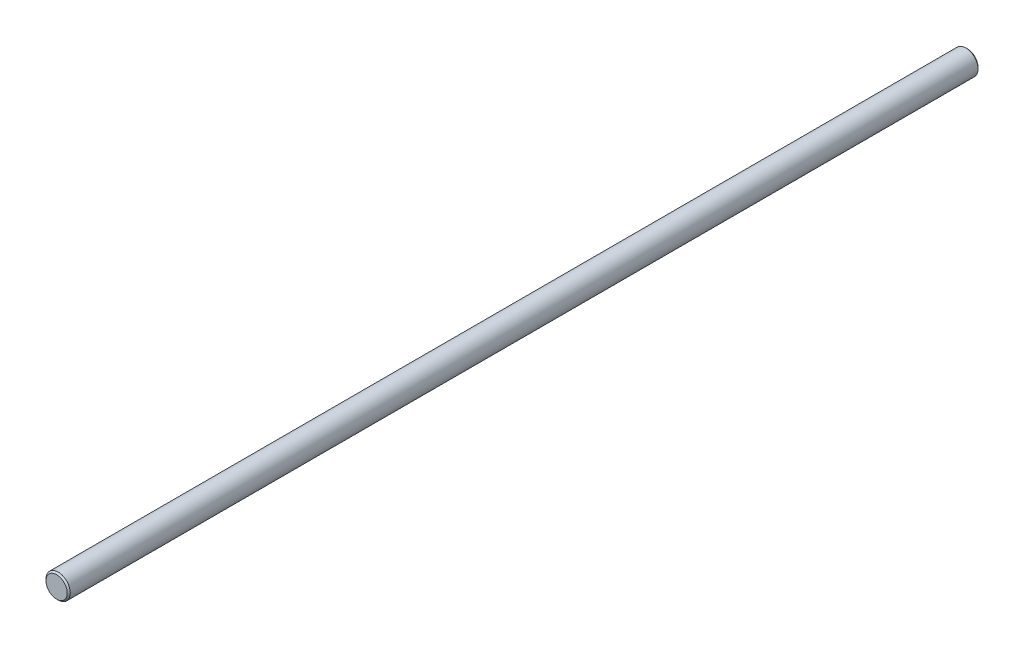
ISO-10303-21;
HEADER;
FILE_DESCRIPTION(('STEP AP214'),'2;1');
FILE_NAME('part.step','',(''),(''),'','','');
FILE_SCHEMA(('AUTOMOTIVE_DESIGN { 1 0 10303 214 1 1 1 1 }'));
ENDSEC;
DATA;
#1=APPLICATION_CONTEXT('core data for automotive mechanical design processes');
#2=APPLICATION_PROTOCOL_DEFINITION('international standard','automotive_design',2000,#1);
#3=PRODUCT_CONTEXT('',#1,'mechanical');
#4=PRODUCT('Part','Part','',(#3));
#5=PRODUCT_RELATED_PRODUCT_CATEGORY('part','',(#4));
#6=PRODUCT_DEFINITION_FORMATION('','',#4);
#7=PRODUCT_DEFINITION_CONTEXT('part definition',#1,'design');
#8=PRODUCT_DEFINITION('design','',#6,#7);
#9=PRODUCT_DEFINITION_SHAPE('','',#8);
#10=(LENGTH_UNIT() NAMED_UNIT(*) SI_UNIT(.MILLI.,.METRE.));
#11=(NAMED_UNIT(*) PLANE_ANGLE_UNIT() SI_UNIT($,.RADIAN.));
#12=(NAMED_UNIT(*) SI_UNIT($,.STERADIAN.) SOLID_ANGLE_UNIT());
#13=UNCERTAINTY_MEASURE_WITH_UNIT(LENGTH_MEASURE(1.E-05),#10,'distance_accuracy_value','');
#14=(GEOMETRIC_REPRESENTATION_CONTEXT(3) GLOBAL_UNCERTAINTY_ASSIGNED_CONTEXT((#13)) GLOBAL_UNIT_ASSIGNED_CONTEXT((#10,
#11,#12)) REPRESENTATION_CONTEXT('',''));
#15=CARTESIAN_POINT('',(0.,0.,0.));
#16=DIRECTION('',(0.,0.,1.));
#17=DIRECTION('',(1.,0.,0.));
#18=AXIS2_PLACEMENT_3D('',#15,#16,#17);
#19=CARTESIAN_POINT('',(0.,0.,300.));
#20=DIRECTION('',(0.,0.,-1.));
#21=DIRECTION('',(-1.,0.,0.));
#22=AXIS2_PLACEMENT_3D('',#19,#20,#21);
#23=CYLINDRICAL_SURFACE('',#22,4.);
#24=CARTESIAN_POINT('',(0.,0.,299.5));
#25=DIRECTION('',(0.,0.,1.));
#26=DIRECTION('',(1.,0.,0.));
#27=AXIS2_PLACEMENT_3D('',#24,#25,#26);
#28=CIRCLE('',#27,4.);
#29=CARTESIAN_POINT('',(4.,0.,299.5));
#30=VERTEX_POINT('',#29);
#31=EDGE_CURVE('E36',#30,#30,#28,.F.);
#32=ORIENTED_EDGE('',*,*,#31,.T.);
#33=EDGE_LOOP('',(#32));
#34=FACE_BOUND('',#33,.T.);
#35=CARTESIAN_POINT('',(0.,0.,0.500000000000056));
#36=DIRECTION('',(0.,0.,1.));
#37=DIRECTION('',(1.,0.,0.));
#38=AXIS2_PLACEMENT_3D('',#35,#36,#37);
#39=CIRCLE('',#38,4.);
#40=CARTESIAN_POINT('',(4.,0.,0.500000000000056));
#41=VERTEX_POINT('',#40);
#42=EDGE_CURVE('E40',#41,#41,#39,.T.);
#43=ORIENTED_EDGE('',*,*,#42,.T.);
#44=EDGE_LOOP('',(#43));
#45=FACE_BOUND('',#44,.T.);
#46=ADVANCED_FACE('F29',(#34,#45),#23,.T.);
#47=CARTESIAN_POINT('',(0.,0.,300.));
#48=DIRECTION('',(0.,0.,1.));
#49=DIRECTION('',(1.,0.,0.));
#50=AXIS2_PLACEMENT_3D('',#47,#48,#49);
#51=PLANE('',#50);
#52=CARTESIAN_POINT('',(0.,0.,300.));
#53=DIRECTION('',(0.,0.,1.));
#54=DIRECTION('',(1.,0.,0.));
#55=AXIS2_PLACEMENT_3D('',#52,#53,#54);
#56=CIRCLE('',#55,3.5);
#57=CARTESIAN_POINT('',(3.5,0.,300.));
#58=VERTEX_POINT('',#57);
#59=EDGE_CURVE('E44',#58,#58,#56,.T.);
#60=ORIENTED_EDGE('',*,*,#59,.T.);
#61=EDGE_LOOP('',(#60));
#62=FACE_BOUND('',#61,.T.);
#63=ADVANCED_FACE('F50',(#62),#51,.T.);
#64=CARTESIAN_POINT('',(0.,0.,0.));
#65=DIRECTION('',(0.,0.,1.));
#66=DIRECTION('',(1.,0.,0.));
#67=AXIS2_PLACEMENT_3D('',#64,#65,#66);
#68=PLANE('',#67);
#69=CARTESIAN_POINT('',(0.,0.,0.));
#70=DIRECTION('',(0.,0.,1.));
#71=DIRECTION('',(1.,0.,0.));
#72=AXIS2_PLACEMENT_3D('',#69,#70,#71);
#73=CIRCLE('',#72,3.49999999999998);
#74=CARTESIAN_POINT('',(3.49999999999998,0.,0.));
#75=VERTEX_POINT('',#74);
#76=EDGE_CURVE('E10',#75,#75,#73,.F.);
#77=ORIENTED_EDGE('',*,*,#76,.T.);
#78=EDGE_LOOP('',(#77));
#79=FACE_BOUND('',#78,.T.);
#80=ADVANCED_FACE('F54',(#79),#68,.F.);
#81=CARTESIAN_POINT('',(0.,0.,300.));
#82=DIRECTION('',(0.,0.,-1.));
#83=DIRECTION('',(-1.,0.,0.));
#84=AXIS2_PLACEMENT_3D('',#81,#82,#83);
#85=CONICAL_SURFACE('',#84,3.5,0.785398163397445);
#86=ORIENTED_EDGE('',*,*,#31,.F.);
#87=EDGE_LOOP('',(#86));
#88=FACE_BOUND('',#87,.T.);
#89=ORIENTED_EDGE('',*,*,#59,.F.);
#90=EDGE_LOOP('',(#89));
#91=FACE_BOUND('',#90,.T.);
#92=ADVANCED_FACE('F52',(#88,#91),#85,.T.);
#93=CARTESIAN_POINT('',(0.,0.,0.500000000000056));
#94=DIRECTION('',(0.,0.,1.));
#95=DIRECTION('',(1.,0.,0.));
#96=AXIS2_PLACEMENT_3D('',#93,#94,#95);
#97=CONICAL_SURFACE('',#96,4.,0.785398163397417);
#98=ORIENTED_EDGE('',*,*,#76,.F.);
#99=EDGE_LOOP('',(#98));
#100=FACE_BOUND('',#99,.T.);
#101=ORIENTED_EDGE('',*,*,#42,.F.);
#102=EDGE_LOOP('',(#101));
#103=FACE_BOUND('',#102,.T.);
#104=ADVANCED_FACE('F31',(#100,#103),#97,.T.);
#105=CLOSED_SHELL('',(#46,#63,#80,#92,#104));
#106=MANIFOLD_SOLID_BREP('B2',#105);
#107=ADVANCED_BREP_SHAPE_REPRESENTATION('',(#18,#106),#14);
#108=SHAPE_DEFINITION_REPRESENTATION(#9,#107);
ENDSEC;
END-ISO-10303-21;
